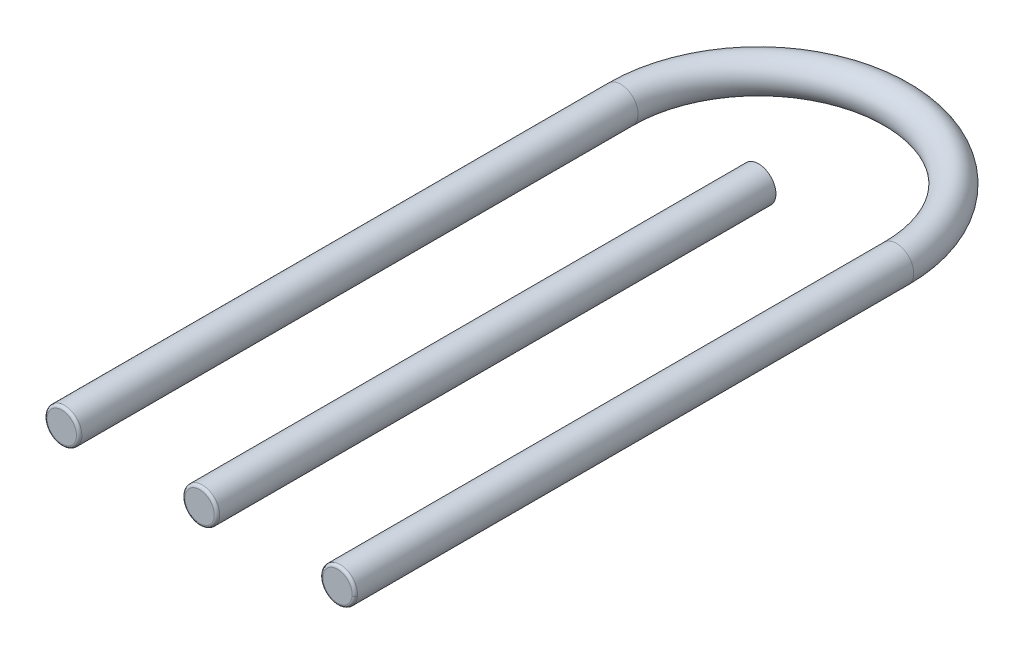
ISO-10303-21;
HEADER;
FILE_DESCRIPTION(('STEP AP214'),'2;1');
FILE_NAME('part.step','',(''),(''),'','','');
FILE_SCHEMA(('AUTOMOTIVE_DESIGN { 1 0 10303 214 1 1 1 1 }'));
ENDSEC;
DATA;
#1=APPLICATION_CONTEXT('core data for automotive mechanical design processes');
#2=APPLICATION_PROTOCOL_DEFINITION('international standard','automotive_design',2000,#1);
#3=PRODUCT_CONTEXT('',#1,'mechanical');
#4=PRODUCT('Part','Part','',(#3));
#5=PRODUCT_RELATED_PRODUCT_CATEGORY('part','',(#4));
#6=PRODUCT_DEFINITION_FORMATION('','',#4);
#7=PRODUCT_DEFINITION_CONTEXT('part definition',#1,'design');
#8=PRODUCT_DEFINITION('design','',#6,#7);
#9=PRODUCT_DEFINITION_SHAPE('','',#8);
#10=(LENGTH_UNIT() NAMED_UNIT(*) SI_UNIT(.MILLI.,.METRE.));
#11=(NAMED_UNIT(*) PLANE_ANGLE_UNIT() SI_UNIT($,.RADIAN.));
#12=(NAMED_UNIT(*) SI_UNIT($,.STERADIAN.) SOLID_ANGLE_UNIT());
#13=UNCERTAINTY_MEASURE_WITH_UNIT(LENGTH_MEASURE(1.E-05),#10,'distance_accuracy_value','');
#14=(GEOMETRIC_REPRESENTATION_CONTEXT(3) GLOBAL_UNCERTAINTY_ASSIGNED_CONTEXT((#13)) GLOBAL_UNIT_ASSIGNED_CONTEXT((#10,
#11,#12)) REPRESENTATION_CONTEXT('',''));
#15=CARTESIAN_POINT('',(0.,0.,0.));
#16=DIRECTION('',(0.,0.,1.));
#17=DIRECTION('',(1.,0.,0.));
#18=AXIS2_PLACEMENT_3D('',#15,#16,#17);
#19=CARTESIAN_POINT('',(0.,0.,10.3));
#20=DIRECTION('',(0.,0.,-1.));
#21=DIRECTION('',(-1.,0.,0.));
#22=AXIS2_PLACEMENT_3D('',#19,#20,#21);
#23=PLANE('',#22);
#24=CARTESIAN_POINT('',(-5.05356635606848,0.268754618530253,10.2999999735349));
#25=CARTESIAN_POINT('',(-5.04930612377895,0.268335409882181,10.2999999738134));
#26=CARTESIAN_POINT('',(-5.04505588388885,0.267814742167709,10.2999999740897));
#27=CARTESIAN_POINT('',(-5.03658495931805,0.266572026278047,10.2999999746379));
#28=CARTESIAN_POINT('',(-5.03236427454852,0.265849978708401,10.2999999749098));
#29=CARTESIAN_POINT('',(-5.02396201752654,0.264206040712553,10.2999999754492));
#30=CARTESIAN_POINT('',(-5.01978044515653,0.263284150887274,10.2999999757167));
#31=CARTESIAN_POINT('',(-5.01146586387142,0.261242639850621,10.2999999762473));
#32=CARTESIAN_POINT('',(-5.00733285481033,0.260123019233823,10.2999999765105));
#33=CARTESIAN_POINT('',(-4.99912474600723,0.257688572467895,10.2999999770323));
#34=CARTESIAN_POINT('',(-4.99504964609114,0.25637374690575,10.299999977291));
#35=CARTESIAN_POINT('',(-4.98696656916431,0.253551866225491,10.299999977804));
#36=CARTESIAN_POINT('',(-4.98295859195177,0.252044811685418,10.2999999780583));
#37=CARTESIAN_POINT('',(-4.97501882253569,0.248841881309359,10.2999999785626));
#38=CARTESIAN_POINT('',(-4.97108703010309,0.24714600604117,10.2999999788125));
#39=CARTESIAN_POINT('',(-4.96330851994253,0.243569270019802,10.2999999793079));
#40=CARTESIAN_POINT('',(-4.95946180195878,0.241688409822888,10.2999999795535));
#41=CARTESIAN_POINT('',(-4.95186213800098,0.237745957832708,10.2999999800401));
#42=CARTESIAN_POINT('',(-4.948109191745,0.235684366582919,10.2999999802812));
#43=CARTESIAN_POINT('',(-4.94070555646171,0.231385115046064,10.2999999807591));
#44=CARTESIAN_POINT('',(-4.93705486712695,0.229147455288458,10.2999999809958));
#45=CARTESIAN_POINT('',(-4.92986399964276,0.224501127363298,10.2999999814649));
#46=CARTESIAN_POINT('',(-4.92632382116104,0.22209245970999,10.2999999816972));
#47=CARTESIAN_POINT('',(-4.91936197941346,0.217109563259402,10.2999999821575));
#48=CARTESIAN_POINT('',(-4.91594031579125,0.214535334959991,10.2999999823855));
#49=CARTESIAN_POINT('',(-4.90922323977129,0.20922713879862,10.2999999828369));
#50=CARTESIAN_POINT('',(-4.90592782699394,0.206493171417025,10.2999999830605));
#51=CARTESIAN_POINT('',(-4.89947070316008,0.200871679823863,10.2999999835032));
#52=CARTESIAN_POINT('',(-4.89630899170156,0.197984156074073,10.2999999837223));
#53=CARTESIAN_POINT('',(-4.89012641864498,0.192062081646059,10.2999999841562));
#54=CARTESIAN_POINT('',(-4.8871055566234,0.18902753140998,10.299999984371));
#55=CARTESIAN_POINT('',(-4.88121151206273,0.182818266313165,10.2999999847961));
#56=CARTESIAN_POINT('',(-4.87833832907959,0.179643551873941,10.2999999850065));
#57=CARTESIAN_POINT('',(-4.87274613825981,0.173161137558529,10.2999999854228));
#58=CARTESIAN_POINT('',(-4.87002712995956,0.169853438082268,10.2999999856287));
#59=CARTESIAN_POINT('',(-4.86474943552622,0.16311253352968,10.2999999860363));
#60=CARTESIAN_POINT('',(-4.86219074891104,0.15967932883079,10.2999999862378));
#61=CARTESIAN_POINT('',(-4.85723948232823,0.15269517740464,10.2999999866366));
#62=CARTESIAN_POINT('',(-4.85484690186113,0.149144231031472,10.2999999868337));
#63=CARTESIAN_POINT('',(-4.8502332564376,0.14193262600739,10.2999999872237));
#64=CARTESIAN_POINT('',(-4.84801219096544,0.138271967686425,10.2999999874164));
#65=CARTESIAN_POINT('',(-4.84374659654994,0.130849216538699,10.2999999877976));
#66=CARTESIAN_POINT('',(-4.84170206707576,0.127087124016995,10.299999987986));
#67=CARTESIAN_POINT('',(-4.83779416647876,0.119470011542764,10.2999999883583));
#68=CARTESIAN_POINT('',(-4.83593079481119,0.115614991869715,10.2999999885423));
#69=CARTESIAN_POINT('',(-4.83238942200632,0.10782074223412,10.2999999889059));
#70=CARTESIAN_POINT('',(-4.83071142031161,0.103881512524841,10.2999999890855));
#71=CARTESIAN_POINT('',(-4.82754458046612,0.0959277503129514,10.2999999894402));
#72=CARTESIAN_POINT('',(-4.82605574174652,0.091913218036822,10.2999999896154));
#73=CARTESIAN_POINT('',(-4.82327059312584,0.0838179284004069,10.2999999899614));
#74=CARTESIAN_POINT('',(-4.8219742826458,0.0797371712393061,10.2999999901322));
#75=CARTESIAN_POINT('',(-4.8195771204331,0.071518659228574,10.2999999904694));
#76=CARTESIAN_POINT('',(-4.81847626811266,0.0673809045503806,10.2999999906358));
#77=CARTESIAN_POINT('',(-4.81647251018006,0.0590577537226419,10.2999999909642));
#78=CARTESIAN_POINT('',(-4.81556960397265,0.0548723577163998,10.2999999911262));
#79=CARTESIAN_POINT('',(-4.81396377863621,0.046463388115248,10.2999999914458));
#80=CARTESIAN_POINT('',(-4.8132608589058,0.0422398146351828,10.2999999916034));
#81=CARTESIAN_POINT('',(-4.81205659469192,0.0337640402352116,10.2999999919142));
#82=CARTESIAN_POINT('',(-4.81155524960229,0.0295118394014318,10.2999999920674));
#83=CARTESIAN_POINT('',(-4.81075526704867,0.0209884251147118,10.2999999923695));
#84=CARTESIAN_POINT('',(-4.81045662897511,0.0167172117189848,10.2999999925183));
#85=CARTESIAN_POINT('',(-4.81006273448483,0.00816543006051549,10.2999999928115));
#86=CARTESIAN_POINT('',(-4.8099674774565,0.00388486182594381,10.2999999929559));
#87=CARTESIAN_POINT('',(-4.80998055921908,-0.00467595066393477,10.2999999932404));
#88=CARTESIAN_POINT('',(-4.81008889739774,-0.00895619492017723,10.2999999933804));
#89=CARTESIAN_POINT('',(-4.81050892338638,-0.0175066813978769,10.299999993656));
#90=CARTESIAN_POINT('',(-4.81082061058486,-0.0217769236493738,10.2999999937917));
#91=CARTESIAN_POINT('',(-4.8116466286344,-0.0302977507357959,10.2999999940585));
#92=CARTESIAN_POINT('',(-4.81216095887607,-0.034548335629797,10.2999999941898));
#93=CARTESIAN_POINT('',(-4.81339109884144,-0.0430202371247514,10.2999999944478));
#94=CARTESIAN_POINT('',(-4.81410690795924,-0.047241553813683,10.2999999945747));
#95=CARTESIAN_POINT('',(-4.81573838594955,-0.0556453742581461,10.2999999948239));
#96=CARTESIAN_POINT('',(-4.81665405422104,-0.0598278781303595,10.2999999949464));
#97=CARTESIAN_POINT('',(-4.81868317889975,-0.0681446161180743,10.2999999951868));
#98=CARTESIAN_POINT('',(-4.81979663471216,-0.0722788503786975,10.2999999953049));
#99=CARTESIAN_POINT('',(-4.82221881564894,-0.0804897015191862,10.2999999955366));
#100=CARTESIAN_POINT('',(-4.82352754018606,-0.084566318572285,10.2999999956502));
#101=CARTESIAN_POINT('',(-4.82633729824161,-0.0926527180081313,10.2999999958731));
#102=CARTESIAN_POINT('',(-4.82783833118169,-0.0966625005918321,10.2999999959824));
#103=CARTESIAN_POINT('',(-4.83102931090193,-0.104606164974102,10.2999999961965));
#104=CARTESIAN_POINT('',(-4.83271925711395,-0.10854004700089,10.2999999963013));
#105=CARTESIAN_POINT('',(-4.83628424110555,-0.116323015827784,10.2999999965067));
#106=CARTESIAN_POINT('',(-4.8381592783285,-0.120172102882857,10.2999999966071));
#107=CARTESIAN_POINT('',(-4.84209020358327,-0.127776779108123,10.2999999968036));
#108=CARTESIAN_POINT('',(-4.84414609107122,-0.131532368559457,10.2999999968997));
#109=CARTESIAN_POINT('',(-4.84843406720241,-0.138941558378758,10.2999999970874));
#110=CARTESIAN_POINT('',(-4.85066615531574,-0.142595159053405,10.2999999971791));
#111=CARTESIAN_POINT('',(-4.85530148466497,-0.149792110778677,10.299999997358));
#112=CARTESIAN_POINT('',(-4.85770472538613,-0.153335462160825,10.2999999974453));
#113=CARTESIAN_POINT('',(-4.86267692495558,-0.160303904094733,10.2999999976155));
#114=CARTESIAN_POINT('',(-4.86524588330548,-0.163728995002109,10.2999999976983));
#115=CARTESIAN_POINT('',(-4.87054370846564,-0.170453172226976,10.2999999978597));
#116=CARTESIAN_POINT('',(-4.87327257479497,-0.173752258923372,10.2999999979382));
#117=CARTESIAN_POINT('',(-4.87888404471434,-0.180216968921397,10.2999999980907));
#118=CARTESIAN_POINT('',(-4.88176664784201,-0.183382592624365,10.2999999981648));
#119=CARTESIAN_POINT('',(-4.88767907258135,-0.189573219648601,10.2999999983086));
#120=CARTESIAN_POINT('',(-4.89070889375025,-0.192598223392735,10.2999999983783));
#121=CARTESIAN_POINT('',(-4.89690890295991,-0.198500771511118,10.2999999985132));
#122=CARTESIAN_POINT('',(-4.90007909057852,-0.201378316328803,10.2999999985785));
#123=CARTESIAN_POINT('',(-4.90655266373419,-0.206979441066522,10.2999999987047));
#124=CARTESIAN_POINT('',(-4.90985604887065,-0.209703021449559,10.2999999987656));
#125=CARTESIAN_POINT('',(-4.91658854697894,-0.214990059958225,10.299999998883));
#126=CARTESIAN_POINT('',(-4.92001765957262,-0.217553518565378,10.2999999989395));
#127=CARTESIAN_POINT('',(-4.9269938582749,-0.222514518250815,10.2999999990481));
#128=CARTESIAN_POINT('',(-4.93054094402867,-0.224912059828055,10.2999999991002));
#129=CARTESIAN_POINT('',(-4.93774506802827,-0.229535805371889,10.2999999992));
#130=CARTESIAN_POINT('',(-4.94140210594341,-0.231762009853743,10.2999999992477));
#131=CARTESIAN_POINT('',(-4.94881786467837,-0.236038048568063,10.2999999993388));
#132=CARTESIAN_POINT('',(-4.95257658519236,-0.238087883330925,10.2999999993821));
#133=CARTESIAN_POINT('',(-4.960187209673,-0.24200654878737,10.2999999994643));
#134=CARTESIAN_POINT('',(-4.96403911335937,-0.243875380025289,10.2999999995032));
#135=CARTESIAN_POINT('',(-4.97182739408727,-0.247427813910052,10.2999999995767));
#136=CARTESIAN_POINT('',(-4.97576377087471,-0.24911141711394,10.2999999996112));
#137=CARTESIAN_POINT('',(-4.98371209675815,-0.252289589241036,10.2999999996758));
#138=CARTESIAN_POINT('',(-4.98772404562684,-0.253784158732737,10.299999999706));
#139=CARTESIAN_POINT('',(-4.99581444380156,-0.256580885238324,10.2999999997618));
#140=CARTESIAN_POINT('',(-4.99989289290756,-0.257883042830866,10.2999999997875));
#141=CARTESIAN_POINT('',(-5.00810706938473,-0.260292002253643,10.2999999998346));
#142=CARTESIAN_POINT('',(-5.01224279658359,-0.261398804671389,10.2999999998559));
#143=CARTESIAN_POINT('',(-5.02056217758804,-0.263414552830074,10.2999999998942));
#144=CARTESIAN_POINT('',(-5.02474583124944,-0.26432349916605,10.2999999999111));
#145=CARTESIAN_POINT('',(-5.03315160532329,-0.265941479264784,10.2999999999406));
#146=CARTESIAN_POINT('',(-5.03737372562002,-0.266650513628765,10.2999999999532));
#147=CARTESIAN_POINT('',(-5.04584688576699,-0.267867074762289,10.2999999999738));
#148=CARTESIAN_POINT('',(-5.05009792553021,-0.268374602137855,10.299999999982));
#149=CARTESIAN_POINT('',(-5.05861931365486,-0.26918697691163,10.2999999999939));
#150=CARTESIAN_POINT('',(-5.06288966195818,-0.269491824919393,10.2999999999976));
#151=CARTESIAN_POINT('',(-5.07144000673046,-0.269898250011827,10.3000000000007));
#152=CARTESIAN_POINT('',(-5.07572000317036,-0.269999827707833,10.3000000000001));
#153=CARTESIAN_POINT('',(-5.08,-0.26999947447424,10.2999999999972));
#154=B_SPLINE_CURVE_WITH_KNOTS('',3,(#24,#25,#26,#27,#28,#29,#30,#31,#32,#33,#34,#35,#36,#37,
#38,#39,#40,#41,#42,#43,#44,#45,#46,#47,#48,#49,#50,#51,#52,#53,#54,#55,#56,#57,#58,#59,#60,#61,
#62,#63,#64,#65,#66,#67,#68,#69,#70,#71,#72,#73,#74,#75,#76,#77,#78,#79,#80,#81,#82,#83,#84,#85,
#86,#87,#88,#89,#90,#91,#92,#93,#94,#95,#96,#97,#98,#99,#100,#101,#102,#103,#104,#105,#106,#107,
#108,#109,#110,#111,#112,#113,#114,#115,#116,#117,#118,#119,#120,#121,#122,#123,#124,#125,#126,
#127,#128,#129,#130,#131,#132,#133,#134,#135,#136,#137,#138,#139,#140,#141,#142,#143,#144,#145,
#146,#147,#148,#149,#150,#151,#152,#153),.UNSPECIFIED.,.F.,.F.,(4,2,2,2,2,2,2,2,2,2,2,2,2,2,2,2,
2,2,2,2,2,2,2,2,2,2,2,2,2,2,2,2,2,2,2,2,2,2,2,2,2,2,2,2,2,2,2,2,2,2,2,2,2,2,2,2,2,2,2,2,2,2,2,2,
4),(0.,0.0128412017816026,0.0256823649505115,0.0385234895067264,0.0513645754502468,
0.0642056227810717,0.077046631499201,0.0898876016046342,0.10272853309737,0.115569425977409,
0.12841028024475,0.141251095899391,0.154091872941334,0.166932611370577,0.179773311187119,
0.192613972390961,0.205454594982102,0.218295178960541,0.231135724326277,0.243976231079312,
0.256816699219643,0.26965712874727,0.282497519662194,0.295337871964412,0.308178185653927,
0.321018460730736,0.333858697194839,0.346698895046236,0.359539054284927,0.372379174910911,
0.385219256924188,0.398059300324757,0.410899305112619,0.423739271287772,0.436579198850217,
0.449419087799954,0.462258938136981,0.475098749861299,0.487938522972907,0.500778257471806,
0.513617953357994,0.526457610631472,0.539297229292239,0.552136809340296,0.564976350775642,
0.577815853598276,0.590655317808199,0.60349474340541,0.61633413038991,0.629173478761697,
0.642012788520772,0.654852059667135,0.667691292200786,0.680530486121725,0.693369641429951,
0.706208758125464,0.719047836208265,0.731886875678352,0.744725876535726,0.757564838780388,
0.770403762412337,0.783242647431572,0.796081493838094,0.808920301631904,0.821759070813),.UNSPECIFIED.);
#155=CARTESIAN_POINT('',(-5.05356634658497,0.268754617596886,10.2999999735349));
#156=VERTEX_POINT('',#155);
#157=CARTESIAN_POINT('',(-5.08000001237432,-0.269999474499294,10.2999999999972));
#158=VERTEX_POINT('',#157);
#159=EDGE_CURVE('P0_E58',#156,#158,#154,.T.);
#160=ORIENTED_EDGE('',*,*,#159,.F.);
#161=CARTESIAN_POINT('',(-5.08000000000002,0.269999474475077,10.2999999999972));
#162=CARTESIAN_POINT('',(-5.07889703076987,0.270001640269776,10.30000000002));
#163=CARTESIAN_POINT('',(-5.07779404828127,0.269997046747893,10.2999999999021));
#164=CARTESIAN_POINT('',(-5.07558819587727,0.269974343413304,10.2999999993849));
#165=CARTESIAN_POINT('',(-5.07448532596521,0.269956233275404,10.2999999989857));
#166=CARTESIAN_POINT('',(-5.07227986436414,0.26990649834887,10.2999999979058));
#167=CARTESIAN_POINT('',(-5.07117727268247,0.269874873235097,10.2999999972253));
#168=CARTESIAN_POINT('',(-5.06897253314918,0.269798112573269,10.2999999955827));
#169=CARTESIAN_POINT('',(-5.06787038530889,0.269752976700191,10.2999999946208));
#170=CARTESIAN_POINT('',(-5.06566669900997,0.269649200609469,10.2999999924156));
#171=CARTESIAN_POINT('',(-5.06456516056665,0.269590560066963,10.2999999911724));
#172=CARTESIAN_POINT('',(-5.0623628585256,0.269459782833564,10.2999999884045));
#173=CARTESIAN_POINT('',(-5.06126209494716,0.269387645818024,10.2999999868799));
#174=CARTESIAN_POINT('',(-5.05906150800461,0.269229885706562,10.2999999835493));
#175=CARTESIAN_POINT('',(-5.05796168466376,0.269144262286251,10.2999999817434));
#176=CARTESIAN_POINT('',(-5.05576314338311,0.268959542003696,10.2999999778502));
#177=CARTESIAN_POINT('',(-5.05466442547054,0.268860444817381,10.2999999757629));
#178=CARTESIAN_POINT('',(-5.05356635607114,0.268754618503154,10.299999973535));
#179=B_SPLINE_CURVE_WITH_KNOTS('',3,(#161,#162,#163,#164,#165,#166,#167,#168,#169,#170,#171,
#172,#173,#174,#175,#176,#177,#178),.UNSPECIFIED.,.F.,.F.,(4,2,2,2,2,2,2,2,4),(0.,
0.00330889334353857,0.00661786629810061,0.00992691886368167,0.0132360510402806,
0.0165452628278921,0.0198545542265102,0.0231639252361276,0.0264733758567352),.UNSPECIFIED.);
#180=CARTESIAN_POINT('',(-5.07999998766236,0.269999474499299,10.2999999999972));
#181=VERTEX_POINT('',#180);
#182=EDGE_CURVE('P0_E67',#181,#156,#179,.T.);
#183=ORIENTED_EDGE('',*,*,#182,.F.);
#184=CARTESIAN_POINT('',(-5.10643362510135,-0.268754455345781,10.2999999737037));
#185=CARTESIAN_POINT('',(-5.11069385492244,-0.268335247844074,10.2999999739804));
#186=CARTESIAN_POINT('',(-5.11494409237124,-0.267814581333945,10.2999999742549));
#187=CARTESIAN_POINT('',(-5.12341501215975,-0.266571867961989,10.2999999747996));
#188=CARTESIAN_POINT('',(-5.12763569458801,-0.265849821703792,10.2999999750698));
#189=CARTESIAN_POINT('',(-5.13603794703238,-0.264205886433143,10.2999999756058));
#190=CARTESIAN_POINT('',(-5.1402195171657,-0.263283998019716,10.2999999758716));
#191=CARTESIAN_POINT('',(-5.14853409408662,-0.261242489902071,10.2999999763989));
#192=CARTESIAN_POINT('',(-5.15266710101976,-0.260122870790553,10.2999999766603));
#193=CARTESIAN_POINT('',(-5.16087520567998,-0.25768842712335,10.2999999771788));
#194=CARTESIAN_POINT('',(-5.1649503035806,-0.256373603152797,10.2999999774359));
#195=CARTESIAN_POINT('',(-5.1730333765929,-0.253551725736597,10.2999999779456));
#196=CARTESIAN_POINT('',(-5.17704135190576,-0.252044672867165,10.2999999781983));
#197=CARTESIAN_POINT('',(-5.18498111764185,-0.248841745905857,10.2999999786994));
#198=CARTESIAN_POINT('',(-5.18891290829341,-0.247145872379984,10.2999999789477));
#199=CARTESIAN_POINT('',(-5.19669141501383,-0.243569139909213,10.29999997944));
#200=CARTESIAN_POINT('',(-5.20053813133765,-0.241688281518823,10.299999979684));
#201=CARTESIAN_POINT('',(-5.20813779209956,-0.237745833200084,10.2999999801676));
#202=CARTESIAN_POINT('',(-5.2118907368187,-0.235684243813495,10.2999999804071));
#203=CARTESIAN_POINT('',(-5.21929436915393,-0.231384996053818,10.299999980882));
#204=CARTESIAN_POINT('',(-5.22294505707649,-0.229147338208516,10.2999999811172));
#205=CARTESIAN_POINT('',(-5.23013592186311,-0.224501014151104,10.2999999815833));
#206=CARTESIAN_POINT('',(-5.23367609905839,-0.222092348451615,10.2999999818142));
#207=CARTESIAN_POINT('',(-5.24063793836068,-0.217109455944175,10.2999999822715));
#208=CARTESIAN_POINT('',(-5.2440596008229,-0.214535229632519,10.299999982498));
#209=CARTESIAN_POINT('',(-5.25077667465076,-0.209227037474563,10.2999999829466));
#210=CARTESIAN_POINT('',(-5.25407208639481,-0.206493072107111,10.2999999831688));
#211=CARTESIAN_POINT('',(-5.26052920828982,-0.200871584562593,10.2999999836086));
#212=CARTESIAN_POINT('',(-5.26369091884154,-0.197984062845844,10.2999999838264));
#213=CARTESIAN_POINT('',(-5.26987349021176,-0.192061992496798,10.2999999842575));
#214=CARTESIAN_POINT('',(-5.27289435145243,-0.189027444305248,10.2999999844709));
#215=CARTESIAN_POINT('',(-5.27878839457756,-0.182818183303006,10.2999999848933));
#216=CARTESIAN_POINT('',(-5.28166157690466,-0.179643470912493,10.2999999851024));
#217=CARTESIAN_POINT('',(-5.28725376653729,-0.17316106069277,10.299999985516));
#218=CARTESIAN_POINT('',(-5.28997277430494,-0.169853363262221,10.2999999857207));
#219=CARTESIAN_POINT('',(-5.29525046779625,-0.163112462792223,10.2999999861256));
#220=CARTESIAN_POINT('',(-5.29780915400047,-0.159679260129015,10.2999999863259));
#221=CARTESIAN_POINT('',(-5.30276041988232,-0.152695112758456,10.2999999867221));
#222=CARTESIAN_POINT('',(-5.30515300005786,-0.149144168404076,10.299999986918));
#223=CARTESIAN_POINT('',(-5.30976664501672,-0.14193256739505,10.2999999873055));
#224=CARTESIAN_POINT('',(-5.31198771031414,-0.138271911069309,10.299999987497));
#225=CARTESIAN_POINT('',(-5.31625330449572,-0.130849163882965,10.2999999878758));
#226=CARTESIAN_POINT('',(-5.31829783390903,-0.127087073326457,10.2999999880629));
#227=CARTESIAN_POINT('',(-5.32220573449661,-0.119469964747236,10.2999999884329));
#228=CARTESIAN_POINT('',(-5.3240691062139,-0.115614947003118,10.2999999886157));
#229=CARTESIAN_POINT('',(-5.32761047922693,-0.10782070118394,10.299999988977));
#230=CARTESIAN_POINT('',(-5.32928848107833,-0.103881473361344,10.2999999891554));
#231=CARTESIAN_POINT('',(-5.33245532134199,-0.0959277148755656,10.299999989508));
#232=CARTESIAN_POINT('',(-5.33394416032128,-0.0919131844381479,10.299999989682));
#233=CARTESIAN_POINT('',(-5.33672930956198,-0.0838178984263722,10.2999999900258));
#234=CARTESIAN_POINT('',(-5.3380256204005,-0.0797371430505697,10.2999999901955));
#235=CARTESIAN_POINT('',(-5.3404227834263,-0.0715186345524163,10.2999999905306));
#236=CARTESIAN_POINT('',(-5.34152363619949,-0.0673808816009614,10.2999999906959));
#237=CARTESIAN_POINT('',(-5.34352739512895,-0.0590577341637568,10.2999999910222));
#238=CARTESIAN_POINT('',(-5.3444303018786,-0.0548723398208574,10.2999999911832));
#239=CARTESIAN_POINT('',(-5.34603612838587,-0.0464633734788446,10.2999999915008));
#240=CARTESIAN_POINT('',(-5.34673904874298,-0.0422398015942128,10.2999999916574));
#241=CARTESIAN_POINT('',(-5.3479433142914,-0.0337640303132929,10.2999999919662));
#242=CARTESIAN_POINT('',(-5.34844466008696,-0.0295118310028588,10.2999999921184));
#243=CARTESIAN_POINT('',(-5.34924464412812,-0.02098841968709,10.2999999924185));
#244=CARTESIAN_POINT('',(-5.34954328298138,-0.0167172077387878,10.2999999925664));
#245=CARTESIAN_POINT('',(-5.34993717910114,-0.00816542889585834,10.2999999928578));
#246=CARTESIAN_POINT('',(-5.35003243697731,-0.00388486202931289,10.2999999930013));
#247=CARTESIAN_POINT('',(-5.35001935697471,0.00467594780702936,10.2999999932839));
#248=CARTESIAN_POINT('',(-5.34991101970626,0.00895619077775864,10.299999993423));
#249=CARTESIAN_POINT('',(-5.3494909955964,0.0175066747697839,10.2999999936969));
#250=CARTESIAN_POINT('',(-5.34917930936457,0.0217769158210243,10.2999999938317));
#251=CARTESIAN_POINT('',(-5.34835329330064,0.0302977405947452,10.2999999940968));
#252=CARTESIAN_POINT('',(-5.34783896407602,0.0345483243761145,10.2999999942272));
#253=CARTESIAN_POINT('',(-5.34660882619092,0.0430202237356945,10.2999999944836));
#254=CARTESIAN_POINT('',(-5.34589301813443,0.0472415394016053,10.2999999946097));
#255=CARTESIAN_POINT('',(-5.34426154230669,0.0556453578916089,10.2999999948574));
#256=CARTESIAN_POINT('',(-5.34334587513458,0.0598278608320148,10.299999994979));
#257=CARTESIAN_POINT('',(-5.3413167526883,0.0681445970490029,10.299999995218));
#258=CARTESIAN_POINT('',(-5.34020329800707,0.0722788304702481,10.2999999953352));
#259=CARTESIAN_POINT('',(-5.33778111936005,0.0804896800257869,10.2999999955655));
#260=CARTESIAN_POINT('',(-5.33647239597964,0.0845662963327663,10.2999999956784));
#261=CARTESIAN_POINT('',(-5.33366264025861,0.0926526943707101,10.2999999958998));
#262=CARTESIAN_POINT('',(-5.3321616084945,0.0966624763019926,10.2999999960084));
#263=CARTESIAN_POINT('',(-5.328970631141,0.104606139473907,10.2999999962211));
#264=CARTESIAN_POINT('',(-5.32728068611795,0.108540020942036,10.2999999963253));
#265=CARTESIAN_POINT('',(-5.32371570451282,0.116322988745853,10.2999999965293));
#266=CARTESIAN_POINT('',(-5.32184066848562,0.120172075335703,10.2999999966291));
#267=CARTESIAN_POINT('',(-5.31790974562468,0.127776750724146,10.2999999968244));
#268=CARTESIAN_POINT('',(-5.31585385933311,0.131532339802991,10.2999999969199));
#269=CARTESIAN_POINT('',(-5.3115658855909,0.138941528969948,10.2999999971064));
#270=CARTESIAN_POINT('',(-5.3093337986685,0.142595129363769,10.2999999971975));
#271=CARTESIAN_POINT('',(-5.30469847169135,0.149792080618662,10.2999999973753));
#272=CARTESIAN_POINT('',(-5.30229523214972,0.15333543181021,10.299999997462));
#273=CARTESIAN_POINT('',(-5.29732303492366,0.160303873452471,10.299999997631));
#274=CARTESIAN_POINT('',(-5.29475407773606,0.163728964257678,10.2999999977134));
#275=CARTESIAN_POINT('',(-5.28945625487909,0.170453141365691,10.2999999978737));
#276=CARTESIAN_POINT('',(-5.28672738968912,0.173752228046206,10.2999999979517));
#277=CARTESIAN_POINT('',(-5.28111592202152,0.180216938097545,10.2999999981032));
#278=CARTESIAN_POINT('',(-5.27823332000479,0.183382561868441,10.2999999981768));
#279=CARTESIAN_POINT('',(-5.27232089745496,0.18957318911087,10.2999999983197));
#280=CARTESIAN_POINT('',(-5.26929107736324,0.192598193003933,10.2999999983889));
#281=CARTESIAN_POINT('',(-5.26309107027036,0.198500741499458,10.299999998523));
#282=CARTESIAN_POINT('',(-5.25992088369005,0.201378286543954,10.2999999985879));
#283=CARTESIAN_POINT('',(-5.25344731256842,0.206979411811219,10.2999999987133));
#284=CARTESIAN_POINT('',(-5.25014392842646,0.209702992495527,10.2999999987738));
#285=CARTESIAN_POINT('',(-5.24341143225991,0.214990031679011,10.2999999988904));
#286=CARTESIAN_POINT('',(-5.23998232061228,0.217553490658189,10.2999999989466));
#287=CARTESIAN_POINT('',(-5.23300612375038,0.222514491156026,10.2999999990545));
#288=CARTESIAN_POINT('',(-5.22945903888982,0.224912033172064,10.2999999991062));
#289=CARTESIAN_POINT('',(-5.22225491662068,0.229535779657665,10.2999999992054));
#290=CARTESIAN_POINT('',(-5.21859787954176,0.231761984640858,10.2999999992528));
#291=CARTESIAN_POINT('',(-5.21118212241937,0.2360380244176,10.2999999993432));
#292=CARTESIAN_POINT('',(-5.20742340268077,0.23808785973987,10.2999999993862));
#293=CARTESIAN_POINT('',(-5.19981277968741,0.242006526370226,10.2999999994679));
#294=CARTESIAN_POINT('',(-5.19596087671205,0.243875358220927,10.2999999995066));
#295=CARTESIAN_POINT('',(-5.18817259733937,0.247427793381498,10.2999999995796));
#296=CARTESIAN_POINT('',(-5.18423622119532,0.249111397246652,10.2999999996138));
#297=CARTESIAN_POINT('',(-5.17628789652885,0.252289570741477,10.2999999996781));
#298=CARTESIAN_POINT('',(-5.17227594823302,0.253784140937845,10.299999999708));
#299=CARTESIAN_POINT('',(-5.16418555113154,0.256580868892758,10.2999999997635));
#300=CARTESIAN_POINT('',(-5.16010710252528,0.257883027228131,10.299999999789));
#301=CARTESIAN_POINT('',(-5.15189292697278,0.260291988171201,10.2999999998358));
#302=CARTESIAN_POINT('',(-5.1477572001983,0.261398791364554,10.299999999857));
#303=CARTESIAN_POINT('',(-5.13943781996581,0.263414541103603,10.299999999895));
#304=CARTESIAN_POINT('',(-5.13525416665153,0.264323488242455,10.2999999999118));
#305=CARTESIAN_POINT('',(-5.12684839319348,0.2659414699705,10.2999999999411));
#306=CARTESIAN_POINT('',(-5.12262627316507,0.266650505159017,10.2999999999535));
#307=CARTESIAN_POINT('',(-5.11415311347503,0.267867067959496,10.2999999999741));
#308=CARTESIAN_POINT('',(-5.10990207390014,0.268374596175567,10.2999999999822));
#309=CARTESIAN_POINT('',(-5.10138068607153,0.269186972642497,10.2999999999939));
#310=CARTESIAN_POINT('',(-5.09711033787574,0.269491821500983,10.2999999999977));
#311=CARTESIAN_POINT('',(-5.08855999323733,0.269898248301231,10.3000000000007));
#312=CARTESIAN_POINT('',(-5.08427999682368,0.269999826852395,10.3000000000001));
#313=CARTESIAN_POINT('',(-5.08,0.26999947447424,10.2999999999972));
#314=B_SPLINE_CURVE_WITH_KNOTS('',3,(#184,#185,#186,#187,#188,#189,#190,#191,#192,#193,#194,
#195,#196,#197,#198,#199,#200,#201,#202,#203,#204,#205,#206,#207,#208,#209,#210,#211,#212,#213,
#214,#215,#216,#217,#218,#219,#220,#221,#222,#223,#224,#225,#226,#227,#228,#229,#230,#231,#232,
#233,#234,#235,#236,#237,#238,#239,#240,#241,#242,#243,#244,#245,#246,#247,#248,#249,#250,#251,
#252,#253,#254,#255,#256,#257,#258,#259,#260,#261,#262,#263,#264,#265,#266,#267,#268,#269,#270,
#271,#272,#273,#274,#275,#276,#277,#278,#279,#280,#281,#282,#283,#284,#285,#286,#287,#288,#289,
#290,#291,#292,#293,#294,#295,#296,#297,#298,#299,#300,#301,#302,#303,#304,#305,#306,#307,#308,
#309,#310,#311,#312,#313),.UNSPECIFIED.,.F.,.F.,(4,2,2,2,2,2,2,2,2,2,2,2,2,2,2,2,2,2,2,2,2,2,2,
2,2,2,2,2,2,2,2,2,2,2,2,2,2,2,2,2,2,2,2,2,2,2,2,2,2,2,2,2,2,2,2,2,2,2,2,2,2,2,2,2,4),(0.,
0.0128411940757024,0.0256823496607427,0.0385234667551183,0.051364545358831,0.0642055854718788,
0.0770465870942615,0.089887550225978,0.102728474867028,0.115569361017411,0.128410208677126,
0.141251017846174,0.154091788524554,0.166932520712263,0.179773214409304,0.192613869615674,
0.205454486331373,0.218295064556401,0.231135604290758,0.243976105534443,0.256816568287455,
0.269656992549794,0.28249737832146,0.295337725602452,0.30817803439277,0.321018304692413,
0.333858536501381,0.346698729819674,0.359538884647291,0.372379000984232,0.385219078830497,
0.398059118186084,0.410899119050995,0.423739081425227,0.436579005308783,0.44941889070166,
0.462258737603859,0.475098546015379,0.48793831593622,0.500778047366382,0.513617740305865,
0.526457394754668,0.539297010712791,0.552136588180233,0.564976127156996,0.577815627643078,
0.590655089638479,0.603494513143199,0.616333898157239,0.629173244680597,0.642012552713274,
0.654851822255269,0.667691053306582,0.680530245867214,0.693369399937164,0.706208515516432,
0.719047592605017,0.731886631202921,0.744725631310142,0.757564592926682,0.770403516052538,
0.783242400687712,0.796081246832205,0.808920054486014,0.821758823649141),.UNSPECIFIED.);
#315=CARTESIAN_POINT('',(-5.1064336189396,-0.268754455926109,10.2999999737037));
#316=VERTEX_POINT('',#315);
#317=EDGE_CURVE('P0_E63',#316,#181,#314,.T.);
#318=ORIENTED_EDGE('',*,*,#317,.F.);
#319=CARTESIAN_POINT('',(-5.07999999999999,-0.269999474475077,10.2999999999972));
#320=CARTESIAN_POINT('',(-5.08110296907294,-0.270001633426119,10.3000000000199));
#321=CARTESIAN_POINT('',(-5.08220595136241,-0.269997033062669,10.2999999999028));
#322=CARTESIAN_POINT('',(-5.0844118032005,-0.269974316049828,10.2999999993891));
#323=CARTESIAN_POINT('',(-5.08551467274577,-0.26995619907627,10.2999999989924));
#324=CARTESIAN_POINT('',(-5.0877201334457,-0.269906450486382,10.2999999979195));
#325=CARTESIAN_POINT('',(-5.08882272459306,-0.269874818545941,10.2999999972433));
#326=CARTESIAN_POINT('',(-5.09102746289031,-0.269798044241819,10.2999999956113));
#327=CARTESIAN_POINT('',(-5.09212961002893,-0.269752901554143,10.2999999946555));
#328=CARTESIAN_POINT('',(-5.09433329475731,-0.269649111848343,10.2999999924644));
#329=CARTESIAN_POINT('',(-5.09543483233183,-0.269590464506385,10.299999991229));
#330=CARTESIAN_POINT('',(-5.09763713246835,-0.269459673691273,10.2999999884788));
#331=CARTESIAN_POINT('',(-5.09873789501114,-0.269387529894498,10.2999999869639));
#332=CARTESIAN_POINT('',(-5.10093847971578,-0.269229756240828,10.2999999836545));
#333=CARTESIAN_POINT('',(-5.10203830185446,-0.269144126060568,10.29999998186));
#334=CARTESIAN_POINT('',(-5.10423684056452,-0.268959392281438,10.2999999779915));
#335=CARTESIAN_POINT('',(-5.10533555710878,-0.268860288359522,10.2999999759175));
#336=CARTESIAN_POINT('',(-5.10643362509871,-0.268754455318943,10.2999999737037));
#337=B_SPLINE_CURVE_WITH_KNOTS('',3,(#319,#320,#321,#322,#323,#324,#325,#326,#327,#328,#329,
#330,#331,#332,#333,#334,#335,#336),.UNSPECIFIED.,.F.,.F.,(4,2,2,2,2,2,2,2,4),(0.,
0.00330889283173528,0.00661786502288463,0.0099269165734462,0.0132360474834161,
0.0165452577527915,0.0198545473815655,0.0231639163697303,0.0264733647172787),.UNSPECIFIED.);
#338=EDGE_CURVE('P0_E61',#158,#316,#337,.T.);
#339=ORIENTED_EDGE('',*,*,#338,.F.);
#340=EDGE_LOOP('',(#160,#183,#318,#339));
#341=FACE_BOUND('',#340,.T.);
#342=ADVANCED_FACE('P0_F17',(#341),#23,.F.);
#343=CARTESIAN_POINT('',(-5.08,0.,10.25));
#344=DIRECTION('',(0.,0.,-1.));
#345=DIRECTION('',(-1.,0.,0.));
#346=AXIS2_PLACEMENT_3D('',#343,#344,#345);
#347=TOROIDAL_SURFACE('',#346,0.27,0.0500000000000003);
#348=CARTESIAN_POINT('',(-5.08,0.,10.25));
#349=DIRECTION('',(0.,0.,-1.));
#350=DIRECTION('',(-1.,0.,0.));
#351=AXIS2_PLACEMENT_3D('',#348,#349,#350);
#352=CIRCLE('',#351,0.32);
#353=CARTESIAN_POINT('',(-5.4,0.,10.25));
#354=VERTEX_POINT('',#353);
#355=EDGE_CURVE('P0_E72',#354,#354,#352,.T.);
#356=ORIENTED_EDGE('',*,*,#355,.F.);
#357=EDGE_LOOP('',(#356));
#358=FACE_BOUND('',#357,.T.);
#359=ORIENTED_EDGE('',*,*,#317,.T.);
#360=ORIENTED_EDGE('',*,*,#182,.T.);
#361=ORIENTED_EDGE('',*,*,#159,.T.);
#362=ORIENTED_EDGE('',*,*,#338,.T.);
#363=EDGE_LOOP('',(#359,#360,#361,#362));
#364=FACE_BOUND('',#363,.T.);
#365=ADVANCED_FACE('P0_F66',(#358,#364),#347,.T.);
#366=CARTESIAN_POINT('',(-5.08,0.,10.3));
#367=DIRECTION('',(0.,0.,-1.));
#368=DIRECTION('',(-1.,0.,0.));
#369=AXIS2_PLACEMENT_3D('',#366,#367,#368);
#370=CYLINDRICAL_SURFACE('',#369,0.32);
#371=ORIENTED_EDGE('',*,*,#355,.T.);
#372=EDGE_LOOP('',(#371));
#373=FACE_BOUND('',#372,.T.);
#374=CARTESIAN_POINT('',(-5.08,0.,0.));
#375=DIRECTION('',(0.,0.,-1.));
#376=DIRECTION('',(-1.,0.,0.));
#377=AXIS2_PLACEMENT_3D('',#374,#375,#376);
#378=CIRCLE('',#377,0.32);
#379=CARTESIAN_POINT('',(-5.4,0.,0.));
#380=VERTEX_POINT('',#379);
#381=EDGE_CURVE('P0_E135',#380,#380,#378,.T.);
#382=ORIENTED_EDGE('',*,*,#381,.F.);
#383=EDGE_LOOP('',(#382));
#384=FACE_BOUND('',#383,.T.);
#385=ADVANCED_FACE('P0_F88',(#373,#384),#370,.T.);
#386=CARTESIAN_POINT('',(-2.54,0.,0.));
#387=DIRECTION('',(0.,1.,0.));
#388=DIRECTION('',(0.,0.,1.));
#389=AXIS2_PLACEMENT_3D('',#386,#387,#388);
#390=TOROIDAL_SURFACE('',#389,2.54,0.32);
#391=CARTESIAN_POINT('',(0.,0.,0.));
#392=DIRECTION('',(0.,0.,1.));
#393=DIRECTION('',(1.,0.,0.));
#394=AXIS2_PLACEMENT_3D('',#391,#392,#393);
#395=CIRCLE('',#394,0.32);
#396=CARTESIAN_POINT('',(0.32,0.,0.));
#397=VERTEX_POINT('',#396);
#398=EDGE_CURVE('P0_E174',#397,#397,#395,.T.);
#399=CARTESIAN_POINT('',(-2.54,0.,0.));
#400=DIRECTION('',(0.,1.,0.));
#401=DIRECTION('',(0.,0.,1.));
#402=AXIS2_PLACEMENT_3D('',#399,#400,#401);
#403=CIRCLE('',#402,2.86);
#404=EDGE_CURVE('',#397,#380,#403,.T.);
#405=ORIENTED_EDGE('',*,*,#398,.F.);
#406=ORIENTED_EDGE('',*,*,#381,.T.);
#407=ORIENTED_EDGE('',*,*,#404,.T.);
#408=ORIENTED_EDGE('',*,*,#404,.F.);
#409=EDGE_LOOP('',(#405,#407,#406,#408));
#410=FACE_BOUND('',#409,.T.);
#411=ADVANCED_FACE('P0_F90',(#410),#390,.T.);
#412=CARTESIAN_POINT('',(0.,0.,10.3));
#413=DIRECTION('',(0.,0.,1.));
#414=DIRECTION('',(1.,0.,0.));
#415=AXIS2_PLACEMENT_3D('',#412,#413,#414);
#416=PLANE('',#415);
#417=DIRECTION('',(0.034502173374473,0.999404622779202,0.));
#418=VECTOR('',#417,1.);
#419=CARTESIAN_POINT('',(0.269356659744274,-0.0186200448039774,10.3));
#420=LINE('',#419,#418);
#421=CARTESIAN_POINT('',(0.269999441614666,0.,10.2999999999982));
#422=VERTEX_POINT('',#421);
#423=CARTESIAN_POINT('',(0.269356201304043,-0.0186200108195476,10.2999999999791));
#424=VERTEX_POINT('',#423);
#425=EDGE_CURVE('P0_E96',#422,#424,#420,.F.);
#426=ORIENTED_EDGE('',*,*,#425,.F.);
#427=CARTESIAN_POINT('',(-0.269356528929642,0.0186200311741396,10.2999999999957));
#428=CARTESIAN_POINT('',(-0.258367482578132,0.17758707874819,10.2999999999957));
#429=CARTESIAN_POINT('',(-0.137698625098715,0.281655845382269,10.2999999999957));
#430=CARTESIAN_POINT('',(0.0211577943941343,0.269169078785671,10.2999999999957));
#431=CARTESIAN_POINT('',(0.180014213886984,0.256682312189072,10.2999999999957));
#432=CARTESIAN_POINT('',(0.282941097137377,0.135038002587324,10.2999999999957));
#433=CARTESIAN_POINT('',(0.268957719444506,-0.0236936782530946,10.2999999999957));
#434=(BOUNDED_CURVE() B_SPLINE_CURVE(3,(#427,#428,#429,#430,#431,#432,#433),.UNSPECIFIED.,.F.,
.F.) B_SPLINE_CURVE_WITH_KNOTS((4,3,4),(0.,0.5,1.),
.UNSPECIFIED.) CURVE() GEOMETRIC_REPRESENTATION_ITEM() RATIONAL_B_SPLINE_CURVE((1.,
0.802511184719807,0.802511184719807,1.,0.802511184719807,0.802511184719807,1.)) REPRESENTATION_ITEM(''));
#435=CARTESIAN_POINT('',(-0.269356214358702,0.0186200118906368,10.2999999999981));
#436=VERTEX_POINT('',#435);
#437=EDGE_CURVE('P0_E104',#436,#422,#434,.T.);
#438=ORIENTED_EDGE('',*,*,#437,.F.);
#439=CARTESIAN_POINT('',(0.,0.,10.2999999999165));
#440=DIRECTION('',(0.,0.,1.));
#441=DIRECTION('',(1.,0.,0.));
#442=AXIS2_PLACEMENT_3D('',#439,#440,#441);
#443=CIRCLE('',#442,0.269997110181366);
#444=EDGE_CURVE('P0_E106',#424,#436,#443,.F.);
#445=ORIENTED_EDGE('',*,*,#444,.F.);
#446=EDGE_LOOP('',(#426,#438,#445));
#447=FACE_BOUND('',#446,.T.);
#448=ADVANCED_FACE('P0_F147',(#447),#416,.T.);
#449=CARTESIAN_POINT('',(0.268360034230395,-0.0236410255120279,10.2999999921128));
#450=CARTESIAN_POINT('',(0.282312337678185,0.134737917437672,10.2999999921128));
#451=CARTESIAN_POINT('',(0.179614181368146,0.256111905721333,10.2999999921128));
#452=CARTESIAN_POINT('',(0.0211107769636671,0.268570923883039,10.2999999921128));
#453=CARTESIAN_POINT('',(-0.137392627440812,0.281029942044745,10.2999999921128));
#454=CARTESIAN_POINT('',(-0.257793331278577,0.177192439875566,10.2999999921128));
#455=CARTESIAN_POINT('',(-0.268757957470164,0.0185786532306395,10.2999999921128));
#456=CARTESIAN_POINT('',(0.268559262655472,-0.0236585764275116,10.2999999947404));
#457=CARTESIAN_POINT('',(0.282521924186015,0.134837945831118,10.2999999947404));
#458=CARTESIAN_POINT('',(0.179747525554728,0.256302041230023,10.2999999947404));
#459=CARTESIAN_POINT('',(0.0211264494420922,0.268770308870972,10.2999999947404));
#460=CARTESIAN_POINT('',(-0.137494626670544,0.281238576511922,10.2999999947404));
#461=CARTESIAN_POINT('',(-0.257984715064667,0.177323986179893,10.2999999947404));
#462=CARTESIAN_POINT('',(-0.268957481310394,0.0185924458798833,10.2999999947404));
#463=CARTESIAN_POINT('',(0.268758491080549,-0.0236761273429953,10.2999999973681));
#464=CARTESIAN_POINT('',(0.282731510693845,0.134937974224565,10.2999999973681));
#465=CARTESIAN_POINT('',(0.17988086974131,0.256492176738713,10.2999999973681));
#466=CARTESIAN_POINT('',(0.0211421219205173,0.268969693858906,10.2999999973681));
#467=CARTESIAN_POINT('',(-0.137596625900275,0.281447210979098,10.2999999973681));
#468=CARTESIAN_POINT('',(-0.258176098850756,0.17745553248422,10.2999999973681));
#469=CARTESIAN_POINT('',(-0.269157005150623,0.0186062385291271,10.2999999973681));
#470=CARTESIAN_POINT('',(0.268957719505626,-0.0236936782584789,10.2999999999957));
#471=CARTESIAN_POINT('',(0.282941097201675,0.135038002618011,10.2999999999957));
#472=CARTESIAN_POINT('',(0.180014213927892,0.256682312247403,10.2999999999957));
#473=CARTESIAN_POINT('',(0.0211577943989423,0.269169078846839,10.2999999999957));
#474=CARTESIAN_POINT('',(-0.137698625130007,0.281655845446275,10.2999999999957));
#475=CARTESIAN_POINT('',(-0.258367482636845,0.177587078788546,10.2999999999957));
#476=CARTESIAN_POINT('',(-0.269356528990853,0.0186200311783709,10.2999999999957));
#477=CARTESIAN_POINT('',(0.298134350790126,-0.0262639770979838,10.3000003848064));
#478=CARTESIAN_POINT('',(0.313634650387132,0.149686974281747,10.3000003848064));
#479=CARTESIAN_POINT('',(0.199542221361168,0.284527302885563,10.3000003848064));
#480=CARTESIAN_POINT('',(0.0234529996345678,0.298368638469585,10.3000003848064));
#481=CARTESIAN_POINT('',(-0.152636222092033,0.312209974053607,10.3000003848064));
#482=CARTESIAN_POINT('',(-0.286395281172079,0.196851789718683,10.3000003848064));
#483=CARTESIAN_POINT('',(-0.298576423273434,0.0206399389363479,10.3000003848064));
#484=CARTESIAN_POINT('',(0.318765480151188,-0.0280814647763021,10.2792896269929));
#485=CARTESIAN_POINT('',(0.335338412557105,0.160045429528143,10.2792896269929));
#486=CARTESIAN_POINT('',(0.213350698549341,0.304216813929926,10.2792896269929));
#487=CARTESIAN_POINT('',(0.0250759654822917,0.319015980720607,10.2792896269929));
#488=CARTESIAN_POINT('',(-0.163198767584757,0.333815147511288,10.2792896269929));
#489=CARTESIAN_POINT('',(-0.306214057769272,0.210474086940991,10.2792896269929));
#490=CARTESIAN_POINT('',(-0.319238144394775,0.0220682387920059,10.2792896269929));
#491=CARTESIAN_POINT('',(0.318765480151188,-0.0280814647763021,10.25));
#492=CARTESIAN_POINT('',(0.335338412557105,0.160045429528143,10.25));
#493=CARTESIAN_POINT('',(0.213350698549341,0.304216813929926,10.25));
#494=CARTESIAN_POINT('',(0.0250759654822917,0.319015980720607,10.25));
#495=CARTESIAN_POINT('',(-0.163198767584757,0.333815147511288,10.25));
#496=CARTESIAN_POINT('',(-0.306214057769272,0.210474086940991,10.25));
#497=CARTESIAN_POINT('',(-0.319238144394775,0.0220682387920059,10.25));
#498=(BOUNDED_SURFACE() B_SPLINE_SURFACE(3,3,((#449,#450,#451,#452,#453,#454,#455),(#456,#457,
#458,#459,#460,#461,#462),(#463,#464,#465,#466,#467,#468,#469),(#470,#471,#472,#473,#474,#475,
#476),(#477,#478,#479,#480,#481,#482,#483),(#484,#485,#486,#487,#488,#489,#490),(#491,#492,#493,
#494,#495,#496,#497)),.UNSPECIFIED.,.F.,.F.,.F.) B_SPLINE_SURFACE_WITH_KNOTS((4,3,4),(4,3,4),
(-0.00848522563444839,0.,1.),(0.,0.5,1.),
.UNSPECIFIED.) GEOMETRIC_REPRESENTATION_ITEM() RATIONAL_B_SPLINE_SURFACE(((1.,0.802511184719807,
0.802511184719807,1.,0.802511184719807,0.802511184719807,1.),(1.,0.802511184719807,
0.802511184719807,1.,0.802511184719807,0.802511184719807,1.),(1.,0.802511184719807,
0.802511184719807,1.,0.802511184719807,0.802511184719807,1.),(1.,0.802511184719807,
0.802511184719807,1.,0.802511184719807,0.802511184719807,1.),(0.80473475742867,
0.645808643569288,0.645808643569288,0.80473475742867,0.645808643569288,0.645808643569288,
0.80473475742867),(0.80473475742867,0.645808643569288,0.645808643569288,0.80473475742867,
0.645808643569288,0.645808643569288,0.80473475742867),(1.,0.802511184719807,0.802511184719807,
1.,0.802511184719807,0.802511184719807,1.))) REPRESENTATION_ITEM('') SURFACE());
#499=CARTESIAN_POINT('',(0.,0.,10.25));
#500=DIRECTION('',(0.,0.,1.));
#501=DIRECTION('',(1.,0.,0.));
#502=AXIS2_PLACEMENT_3D('',#499,#500,#501);
#503=CIRCLE('',#502,0.32);
#504=CARTESIAN_POINT('',(-0.319238144344583,0.0220682395180524,10.25));
#505=VERTEX_POINT('',#504);
#506=CARTESIAN_POINT('',(0.319238144394775,-0.0220682387920058,10.25));
#507=VERTEX_POINT('',#506);
#508=EDGE_CURVE('P0_E27',#505,#507,#503,.F.);
#509=CARTESIAN_POINT('',(-0.269357184163699,0.0186200789311622,10.25));
#510=DIRECTION('',(-0.0689632553006009,-0.997619200606296,0.));
#511=DIRECTION('',(0.997619200606295,-0.0689632553006009,0.));
#512=AXIS2_PLACEMENT_3D('',#509,#510,#511);
#513=CIRCLE('',#512,0.0500000000000007);
#514=EDGE_CURVE('P0_E103',#436,#505,#513,.T.);
#515=CARTESIAN_POINT('',(0.269357184333091,-0.0186200764807549,10.25));
#516=DIRECTION('',(-0.0689632462250182,-0.997619201233671,0.));
#517=DIRECTION('',(0.997619201233671,-0.0689632462250182,0.));
#518=AXIS2_PLACEMENT_3D('',#515,#516,#517);
#519=CIRCLE('',#518,0.0500000000000006);
#520=EDGE_CURVE('P0_E36',#507,#424,#519,.T.);
#521=ORIENTED_EDGE('',*,*,#508,.F.);
#522=ORIENTED_EDGE('',*,*,#514,.F.);
#523=ORIENTED_EDGE('',*,*,#437,.T.);
#524=ORIENTED_EDGE('',*,*,#425,.T.);
#525=ORIENTED_EDGE('',*,*,#520,.F.);
#526=EDGE_LOOP('',(#521,#522,#523,#524,#525));
#527=FACE_BOUND('',#526,.T.);
#528=ADVANCED_FACE('P0_F136',(#527),#498,.T.);
#529=CARTESIAN_POINT('',(0.,0.,10.25));
#530=DIRECTION('',(0.,0.,1.));
#531=DIRECTION('',(1.,0.,0.));
#532=AXIS2_PLACEMENT_3D('',#529,#530,#531);
#533=TOROIDAL_SURFACE('',#532,0.27,0.0500000000000007);
#534=ORIENTED_EDGE('',*,*,#520,.T.);
#535=ORIENTED_EDGE('',*,*,#444,.T.);
#536=ORIENTED_EDGE('',*,*,#514,.T.);
#537=CARTESIAN_POINT('',(0.,0.,10.25));
#538=DIRECTION('',(0.,0.,1.));
#539=DIRECTION('',(1.,0.,0.));
#540=AXIS2_PLACEMENT_3D('',#537,#538,#539);
#541=CIRCLE('',#540,0.32);
#542=EDGE_CURVE('P0_E11',#507,#505,#541,.F.);
#543=ORIENTED_EDGE('',*,*,#542,.F.);
#544=EDGE_LOOP('',(#534,#535,#536,#543));
#545=FACE_BOUND('',#544,.T.);
#546=ADVANCED_FACE('P0_F19',(#545),#533,.T.);
#547=CARTESIAN_POINT('',(0.,0.,0.));
#548=DIRECTION('',(0.,0.,1.));
#549=DIRECTION('',(1.,0.,0.));
#550=AXIS2_PLACEMENT_3D('',#547,#548,#549);
#551=CYLINDRICAL_SURFACE('',#550,0.32);
#552=ORIENTED_EDGE('',*,*,#398,.T.);
#553=EDGE_LOOP('',(#552));
#554=FACE_BOUND('',#553,.T.);
#555=ORIENTED_EDGE('',*,*,#508,.T.);
#556=ORIENTED_EDGE('',*,*,#542,.T.);
#557=EDGE_LOOP('',(#555,#556));
#558=FACE_BOUND('',#557,.T.);
#559=ADVANCED_FACE('P0_F148',(#554,#558),#551,.T.);
#560=CLOSED_SHELL('',(#342,#365,#385,#411,#448,#528,#546,#559));
#561=MANIFOLD_SOLID_BREP('P0_B1',#560);
#562=CARTESIAN_POINT('',(-2.54,0.,10.3));
#563=DIRECTION('',(0.,0.,1.));
#564=DIRECTION('',(1.,0.,0.));
#565=AXIS2_PLACEMENT_3D('',#562,#563,#564);
#566=PLANE('',#565);
#567=CARTESIAN_POINT('',(-2.54,0.,10.3));
#568=DIRECTION('',(0.,0.,-1.));
#569=DIRECTION('',(-1.,0.,0.));
#570=AXIS2_PLACEMENT_3D('',#567,#568,#569);
#571=CIRCLE('',#570,0.27);
#572=CARTESIAN_POINT('',(-2.27,0.,10.3));
#573=VERTEX_POINT('',#572);
#574=CARTESIAN_POINT('',(-2.81,0.,10.3));
#575=VERTEX_POINT('',#574);
#576=EDGE_CURVE('P1_E34',#573,#575,#571,.F.);
#577=ORIENTED_EDGE('',*,*,#576,.T.);
#578=CARTESIAN_POINT('',(-2.54,0.,10.3));
#579=DIRECTION('',(0.,0.,-1.));
#580=DIRECTION('',(1.,0.,0.));
#581=AXIS2_PLACEMENT_3D('',#578,#579,#580);
#582=CIRCLE('',#581,0.27);
#583=EDGE_CURVE('P1_E38',#573,#575,#582,.T.);
#584=ORIENTED_EDGE('',*,*,#583,.F.);
#585=EDGE_LOOP('',(#577,#584));
#586=FACE_BOUND('',#585,.T.);
#587=ADVANCED_FACE('P1_F16',(#586),#566,.T.);
#588=CARTESIAN_POINT('',(0.,0.,0.));
#589=DIRECTION('',(0.,0.,1.));
#590=DIRECTION('',(1.,0.,0.));
#591=AXIS2_PLACEMENT_3D('',#588,#589,#590);
#592=PLANE('',#591);
#593=CARTESIAN_POINT('',(-2.54,0.,0.));
#594=DIRECTION('',(0.,0.,1.));
#595=DIRECTION('',(1.,0.,0.));
#596=AXIS2_PLACEMENT_3D('',#593,#594,#595);
#597=CIRCLE('',#596,0.32);
#598=CARTESIAN_POINT('',(-2.22,0.,0.));
#599=VERTEX_POINT('',#598);
#600=EDGE_CURVE('P1_E27',#599,#599,#597,.T.);
#601=ORIENTED_EDGE('',*,*,#600,.F.);
#602=EDGE_LOOP('',(#601));
#603=FACE_BOUND('',#602,.T.);
#604=ADVANCED_FACE('P1_F60',(#603),#592,.F.);
#605=CARTESIAN_POINT('',(-2.54,0.,10.25));
#606=DIRECTION('',(0.,0.,1.));
#607=DIRECTION('',(1.,0.,0.));
#608=AXIS2_PLACEMENT_3D('',#605,#606,#607);
#609=TOROIDAL_SURFACE('',#608,0.27,0.05);
#610=CARTESIAN_POINT('',(-2.54,0.,10.25));
#611=DIRECTION('',(0.,0.,1.));
#612=DIRECTION('',(1.,0.,0.));
#613=AXIS2_PLACEMENT_3D('',#610,#611,#612);
#614=CIRCLE('',#613,0.32);
#615=CARTESIAN_POINT('',(-2.22,0.,10.25));
#616=VERTEX_POINT('',#615);
#617=EDGE_CURVE('P1_E10',#616,#616,#614,.F.);
#618=ORIENTED_EDGE('',*,*,#617,.F.);
#619=EDGE_LOOP('',(#618));
#620=FACE_BOUND('',#619,.T.);
#621=ORIENTED_EDGE('',*,*,#583,.T.);
#622=ORIENTED_EDGE('',*,*,#576,.F.);
#623=EDGE_LOOP('',(#621,#622));
#624=FACE_BOUND('',#623,.T.);
#625=ADVANCED_FACE('P1_F42',(#620,#624),#609,.T.);
#626=CARTESIAN_POINT('',(-2.54,0.,-0.905096679918782));
#627=DIRECTION('',(0.,0.,1.));
#628=DIRECTION('',(1.,0.,0.));
#629=AXIS2_PLACEMENT_3D('',#626,#627,#628);
#630=CYLINDRICAL_SURFACE('',#629,0.32);
#631=ORIENTED_EDGE('',*,*,#600,.T.);
#632=EDGE_LOOP('',(#631));
#633=FACE_BOUND('',#632,.T.);
#634=ORIENTED_EDGE('',*,*,#617,.T.);
#635=EDGE_LOOP('',(#634));
#636=FACE_BOUND('',#635,.T.);
#637=ADVANCED_FACE('P1_F59',(#633,#636),#630,.T.);
#638=CLOSED_SHELL('',(#587,#604,#625,#637));
#639=MANIFOLD_SOLID_BREP('P1_B1',#638);
#640=ADVANCED_BREP_SHAPE_REPRESENTATION('',(#18,#561,#639),#14);
#641=SHAPE_DEFINITION_REPRESENTATION(#9,#640);
ENDSEC;
END-ISO-10303-21;
